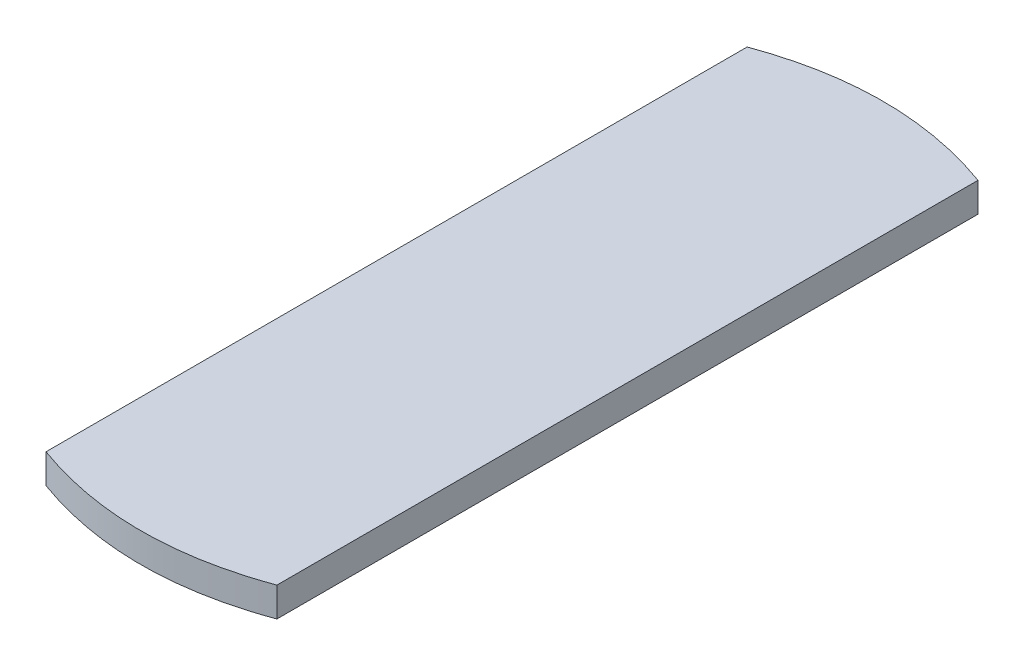
ISO-10303-21;
HEADER;
FILE_DESCRIPTION(('STEP AP214'),'2;1');
FILE_NAME('part.step','',(''),(''),'','','');
FILE_SCHEMA(('AUTOMOTIVE_DESIGN { 1 0 10303 214 1 1 1 1 }'));
ENDSEC;
DATA;
#1=APPLICATION_CONTEXT('core data for automotive mechanical design processes');
#2=APPLICATION_PROTOCOL_DEFINITION('international standard','automotive_design',2000,#1);
#3=PRODUCT_CONTEXT('',#1,'mechanical');
#4=PRODUCT('Part','Part','',(#3));
#5=PRODUCT_RELATED_PRODUCT_CATEGORY('part','',(#4));
#6=PRODUCT_DEFINITION_FORMATION('','',#4);
#7=PRODUCT_DEFINITION_CONTEXT('part definition',#1,'design');
#8=PRODUCT_DEFINITION('design','',#6,#7);
#9=PRODUCT_DEFINITION_SHAPE('','',#8);
#10=(LENGTH_UNIT() NAMED_UNIT(*) SI_UNIT(.MILLI.,.METRE.));
#11=(NAMED_UNIT(*) PLANE_ANGLE_UNIT() SI_UNIT($,.RADIAN.));
#12=(NAMED_UNIT(*) SI_UNIT($,.STERADIAN.) SOLID_ANGLE_UNIT());
#13=UNCERTAINTY_MEASURE_WITH_UNIT(LENGTH_MEASURE(1.E-05),#10,'distance_accuracy_value','');
#14=(GEOMETRIC_REPRESENTATION_CONTEXT(3) GLOBAL_UNCERTAINTY_ASSIGNED_CONTEXT((#13)) GLOBAL_UNIT_ASSIGNED_CONTEXT((#10,
#11,#12)) REPRESENTATION_CONTEXT('',''));
#15=CARTESIAN_POINT('',(0.,0.,0.));
#16=DIRECTION('',(0.,0.,1.));
#17=DIRECTION('',(1.,0.,0.));
#18=AXIS2_PLACEMENT_3D('',#15,#16,#17);
#19=CARTESIAN_POINT('',(-27.5,7.,-83.5000000000001));
#20=CARTESIAN_POINT('',(-0.298519588916663,7.,-93.5000000000001));
#21=CARTESIAN_POINT('',(27.5,7.,-83.5000000000001));
#22=B_SPLINE_CURVE_WITH_KNOTS('',2,(#19,#20,#21),.UNSPECIFIED.,.F.,.F.,(3,3),(0.,1.),.UNSPECIFIED.);
#23=DIRECTION('',(0.,-1.,0.));
#24=VECTOR('',#23,1.);
#25=SURFACE_OF_LINEAR_EXTRUSION('',#22,#24);
#26=CARTESIAN_POINT('',(-27.5,0.,-83.5000000000001));
#27=CARTESIAN_POINT('',(-0.298519588916663,0.,-93.5000000000001));
#28=CARTESIAN_POINT('',(27.5,0.,-83.5000000000001));
#29=B_SPLINE_CURVE_WITH_KNOTS('',2,(#26,#27,#28),.UNSPECIFIED.,.F.,.F.,(3,3),(0.,1.),.UNSPECIFIED.);
#30=CARTESIAN_POINT('',(-27.5,0.,-83.5000000000001));
#31=VERTEX_POINT('',#30);
#32=CARTESIAN_POINT('',(27.5,0.,-83.5000000000001));
#33=VERTEX_POINT('',#32);
#34=EDGE_CURVE('E130',#31,#33,#29,.T.);
#35=ORIENTED_EDGE('',*,*,#34,.F.);
#36=DIRECTION('',(0.,-1.,0.));
#37=VECTOR('',#36,1.);
#38=CARTESIAN_POINT('',(-27.5,7.,-83.5000000000001));
#39=LINE('',#38,#37);
#40=CARTESIAN_POINT('',(-27.5,7.,-83.5000000000001));
#41=VERTEX_POINT('',#40);
#42=EDGE_CURVE('E11',#41,#31,#39,.T.);
#43=ORIENTED_EDGE('',*,*,#42,.F.);
#44=CARTESIAN_POINT('',(27.5,7.,-83.5000000000001));
#45=VERTEX_POINT('',#44);
#46=EDGE_CURVE('E95',#41,#45,#22,.T.);
#47=ORIENTED_EDGE('',*,*,#46,.T.);
#48=DIRECTION('',(0.,-1.,0.));
#49=VECTOR('',#48,1.);
#50=CARTESIAN_POINT('',(27.5,7.,-83.5000000000001));
#51=LINE('',#50,#49);
#52=EDGE_CURVE('E63',#45,#33,#51,.T.);
#53=ORIENTED_EDGE('',*,*,#52,.T.);
#54=EDGE_LOOP('',(#35,#43,#47,#53));
#55=FACE_BOUND('',#54,.T.);
#56=ADVANCED_FACE('F45',(#55),#25,.T.);
#57=CARTESIAN_POINT('',(-27.5,7.,0.));
#58=DIRECTION('',(1.,0.,0.));
#59=DIRECTION('',(0.,0.,-1.));
#60=AXIS2_PLACEMENT_3D('',#57,#58,#59);
#61=PLANE('',#60);
#62=DIRECTION('',(0.,0.,1.));
#63=VECTOR('',#62,1.);
#64=CARTESIAN_POINT('',(-27.5,0.,0.));
#65=LINE('',#64,#63);
#66=CARTESIAN_POINT('',(-27.5,0.,83.5000000000001));
#67=VERTEX_POINT('',#66);
#68=EDGE_CURVE('E102',#31,#67,#65,.T.);
#69=ORIENTED_EDGE('',*,*,#68,.T.);
#70=DIRECTION('',(0.,-1.,0.));
#71=VECTOR('',#70,1.);
#72=CARTESIAN_POINT('',(-27.5,7.,83.5000000000001));
#73=LINE('',#72,#71);
#74=CARTESIAN_POINT('',(-27.5,7.,83.5000000000001));
#75=VERTEX_POINT('',#74);
#76=EDGE_CURVE('E55',#75,#67,#73,.T.);
#77=ORIENTED_EDGE('',*,*,#76,.F.);
#78=DIRECTION('',(0.,0.,1.));
#79=VECTOR('',#78,1.);
#80=CARTESIAN_POINT('',(-27.5,7.,0.));
#81=LINE('',#80,#79);
#82=EDGE_CURVE('E89',#41,#75,#81,.T.);
#83=ORIENTED_EDGE('',*,*,#82,.F.);
#84=ORIENTED_EDGE('',*,*,#42,.T.);
#85=EDGE_LOOP('',(#69,#77,#83,#84));
#86=FACE_BOUND('',#85,.T.);
#87=ADVANCED_FACE('F100',(#86),#61,.F.);
#88=CARTESIAN_POINT('',(-27.5,7.,83.5000000000001));
#89=CARTESIAN_POINT('',(0.185844536660096,7.,93.5000000000001));
#90=CARTESIAN_POINT('',(27.5,7.,83.5000000000001));
#91=B_SPLINE_CURVE_WITH_KNOTS('',2,(#88,#89,#90),.UNSPECIFIED.,.F.,.F.,(3,3),(0.,1.),.UNSPECIFIED.);
#92=DIRECTION('',(0.,-1.,0.));
#93=VECTOR('',#92,1.);
#94=SURFACE_OF_LINEAR_EXTRUSION('',#91,#93);
#95=CARTESIAN_POINT('',(-27.5,0.,83.5000000000001));
#96=CARTESIAN_POINT('',(0.185844536660096,0.,93.5000000000001));
#97=CARTESIAN_POINT('',(27.5,0.,83.5000000000001));
#98=B_SPLINE_CURVE_WITH_KNOTS('',2,(#95,#96,#97),.UNSPECIFIED.,.F.,.F.,(3,3),(0.,1.),.UNSPECIFIED.);
#99=CARTESIAN_POINT('',(27.5,0.,83.5000000000001));
#100=VERTEX_POINT('',#99);
#101=EDGE_CURVE('E135',#67,#100,#98,.T.);
#102=ORIENTED_EDGE('',*,*,#101,.T.);
#103=DIRECTION('',(0.,-1.,0.));
#104=VECTOR('',#103,1.);
#105=CARTESIAN_POINT('',(27.5,7.,83.5000000000001));
#106=LINE('',#105,#104);
#107=CARTESIAN_POINT('',(27.5,7.,83.5000000000001));
#108=VERTEX_POINT('',#107);
#109=EDGE_CURVE('E77',#108,#100,#106,.T.);
#110=ORIENTED_EDGE('',*,*,#109,.F.);
#111=EDGE_CURVE('E94',#75,#108,#91,.T.);
#112=ORIENTED_EDGE('',*,*,#111,.F.);
#113=ORIENTED_EDGE('',*,*,#76,.T.);
#114=EDGE_LOOP('',(#102,#110,#112,#113));
#115=FACE_BOUND('',#114,.T.);
#116=ADVANCED_FACE('F106',(#115),#94,.F.);
#117=CARTESIAN_POINT('',(27.5,7.,0.));
#118=DIRECTION('',(1.,0.,0.));
#119=DIRECTION('',(0.,0.,-1.));
#120=AXIS2_PLACEMENT_3D('',#117,#118,#119);
#121=PLANE('',#120);
#122=DIRECTION('',(0.,0.,1.));
#123=VECTOR('',#122,1.);
#124=CARTESIAN_POINT('',(27.5,0.,0.));
#125=LINE('',#124,#123);
#126=EDGE_CURVE('E147',#33,#100,#125,.T.);
#127=ORIENTED_EDGE('',*,*,#126,.F.);
#128=ORIENTED_EDGE('',*,*,#52,.F.);
#129=DIRECTION('',(0.,0.,1.));
#130=VECTOR('',#129,1.);
#131=CARTESIAN_POINT('',(27.5,7.,0.));
#132=LINE('',#131,#130);
#133=EDGE_CURVE('E108',#45,#108,#132,.T.);
#134=ORIENTED_EDGE('',*,*,#133,.T.);
#135=ORIENTED_EDGE('',*,*,#109,.T.);
#136=EDGE_LOOP('',(#127,#128,#134,#135));
#137=FACE_BOUND('',#136,.T.);
#138=ADVANCED_FACE('F122',(#137),#121,.T.);
#139=CARTESIAN_POINT('',(0.,7.,0.));
#140=DIRECTION('',(0.,1.,0.));
#141=DIRECTION('',(0.,0.,1.));
#142=AXIS2_PLACEMENT_3D('',#139,#140,#141);
#143=PLANE('',#142);
#144=ORIENTED_EDGE('',*,*,#46,.F.);
#145=ORIENTED_EDGE('',*,*,#82,.T.);
#146=ORIENTED_EDGE('',*,*,#111,.T.);
#147=ORIENTED_EDGE('',*,*,#133,.F.);
#148=EDGE_LOOP('',(#144,#145,#146,#147));
#149=FACE_BOUND('',#148,.T.);
#150=ADVANCED_FACE('F91',(#149),#143,.T.);
#151=CARTESIAN_POINT('',(0.,0.,0.));
#152=DIRECTION('',(0.,1.,0.));
#153=DIRECTION('',(0.,0.,1.));
#154=AXIS2_PLACEMENT_3D('',#151,#152,#153);
#155=PLANE('',#154);
#156=ORIENTED_EDGE('',*,*,#34,.T.);
#157=ORIENTED_EDGE('',*,*,#126,.T.);
#158=ORIENTED_EDGE('',*,*,#101,.F.);
#159=ORIENTED_EDGE('',*,*,#68,.F.);
#160=EDGE_LOOP('',(#156,#157,#158,#159));
#161=FACE_BOUND('',#160,.T.);
#162=ADVANCED_FACE('F167',(#161),#155,.F.);
#163=CLOSED_SHELL('',(#56,#87,#116,#138,#150,#162));
#164=MANIFOLD_SOLID_BREP('B2',#163);
#165=ADVANCED_BREP_SHAPE_REPRESENTATION('',(#18,#164),#14);
#166=SHAPE_DEFINITION_REPRESENTATION(#9,#165);
ENDSEC;
END-ISO-10303-21;
